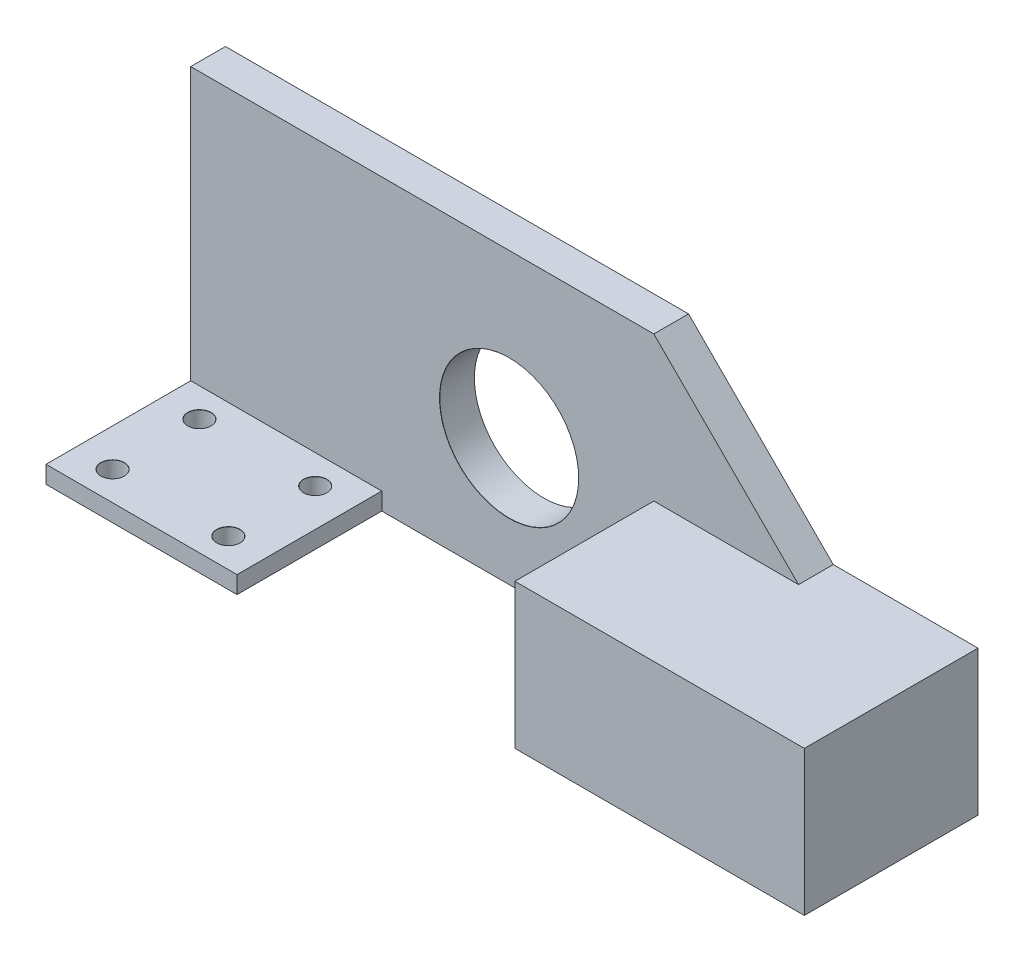
ISO-10303-21;
HEADER;
FILE_DESCRIPTION(('STEP AP214'),'2;1');
FILE_NAME('part.step','',(''),(''),'','','');
FILE_SCHEMA(('AUTOMOTIVE_DESIGN { 1 0 10303 214 1 1 1 1 }'));
ENDSEC;
DATA;
#1=APPLICATION_CONTEXT('core data for automotive mechanical design processes');
#2=APPLICATION_PROTOCOL_DEFINITION('international standard','automotive_design',2000,#1);
#3=PRODUCT_CONTEXT('',#1,'mechanical');
#4=PRODUCT('Part','Part','',(#3));
#5=PRODUCT_RELATED_PRODUCT_CATEGORY('part','',(#4));
#6=PRODUCT_DEFINITION_FORMATION('','',#4);
#7=PRODUCT_DEFINITION_CONTEXT('part definition',#1,'design');
#8=PRODUCT_DEFINITION('design','',#6,#7);
#9=PRODUCT_DEFINITION_SHAPE('','',#8);
#10=(LENGTH_UNIT() NAMED_UNIT(*) SI_UNIT(.MILLI.,.METRE.));
#11=(NAMED_UNIT(*) PLANE_ANGLE_UNIT() SI_UNIT($,.RADIAN.));
#12=(NAMED_UNIT(*) SI_UNIT($,.STERADIAN.) SOLID_ANGLE_UNIT());
#13=UNCERTAINTY_MEASURE_WITH_UNIT(LENGTH_MEASURE(1.E-05),#10,'distance_accuracy_value','');
#14=(GEOMETRIC_REPRESENTATION_CONTEXT(3) GLOBAL_UNCERTAINTY_ASSIGNED_CONTEXT((#13)) GLOBAL_UNIT_ASSIGNED_CONTEXT((#10,
#11,#12)) REPRESENTATION_CONTEXT('',''));
#15=CARTESIAN_POINT('',(0.,0.,0.));
#16=DIRECTION('',(0.,0.,1.));
#17=DIRECTION('',(1.,0.,0.));
#18=AXIS2_PLACEMENT_3D('',#15,#16,#17);
#19=CARTESIAN_POINT('',(-40.,40.,3.));
#20=DIRECTION('',(1.,0.,0.));
#21=DIRECTION('',(0.,1.,0.));
#22=AXIS2_PLACEMENT_3D('',#19,#20,#21);
#23=PLANE('',#22);
#24=DIRECTION('',(0.,-1.,0.));
#25=VECTOR('',#24,1.);
#26=CARTESIAN_POINT('',(-40.,40.,3.));
#27=LINE('',#26,#25);
#28=CARTESIAN_POINT('',(-40.,10.,3.));
#29=VERTEX_POINT('',#28);
#30=CARTESIAN_POINT('',(-40.,-37.,3.));
#31=VERTEX_POINT('',#30);
#32=EDGE_CURVE('E268',#29,#31,#27,.T.);
#33=ORIENTED_EDGE('',*,*,#32,.F.);
#34=DIRECTION('',(0.,0.,1.));
#35=VECTOR('',#34,1.);
#36=CARTESIAN_POINT('',(-40.,10.,-12.));
#37=LINE('',#36,#35);
#38=CARTESIAN_POINT('',(-40.,10.,-3.));
#39=VERTEX_POINT('',#38);
#40=EDGE_CURVE('E179',#39,#29,#37,.T.);
#41=ORIENTED_EDGE('',*,*,#40,.F.);
#42=DIRECTION('',(0.,-1.,0.));
#43=VECTOR('',#42,1.);
#44=CARTESIAN_POINT('',(-40.,40.,-3.));
#45=LINE('',#44,#43);
#46=CARTESIAN_POINT('',(-40.,-40.,-3.));
#47=VERTEX_POINT('',#46);
#48=EDGE_CURVE('E264',#39,#47,#45,.T.);
#49=ORIENTED_EDGE('',*,*,#48,.T.);
#50=DIRECTION('',(0.,0.,-1.));
#51=VECTOR('',#50,1.);
#52=CARTESIAN_POINT('',(-40.,-40.,3.));
#53=LINE('',#52,#51);
#54=CARTESIAN_POINT('',(-40.,-40.,28.));
#55=VERTEX_POINT('',#54);
#56=EDGE_CURVE('E276',#55,#47,#53,.T.);
#57=ORIENTED_EDGE('',*,*,#56,.F.);
#58=DIRECTION('',(0.,-1.,0.));
#59=VECTOR('',#58,1.);
#60=CARTESIAN_POINT('',(-40.,-40.,28.));
#61=LINE('',#60,#59);
#62=CARTESIAN_POINT('',(-40.,-37.,28.));
#63=VERTEX_POINT('',#62);
#64=EDGE_CURVE('E231',#63,#55,#61,.T.);
#65=ORIENTED_EDGE('',*,*,#64,.F.);
#66=DIRECTION('',(0.,0.,-1.));
#67=VECTOR('',#66,1.);
#68=CARTESIAN_POINT('',(-40.,-37.,28.));
#69=LINE('',#68,#67);
#70=EDGE_CURVE('E245',#63,#31,#69,.T.);
#71=ORIENTED_EDGE('',*,*,#70,.T.);
#72=EDGE_LOOP('',(#33,#41,#49,#57,#65,#71));
#73=FACE_BOUND('',#72,.T.);
#74=ADVANCED_FACE('F45',(#73),#23,.F.);
#75=CARTESIAN_POINT('',(-40.,-40.,3.));
#76=DIRECTION('',(0.,1.,0.));
#77=DIRECTION('',(0.,0.,1.));
#78=AXIS2_PLACEMENT_3D('',#75,#76,#77);
#79=PLANE('',#78);
#80=CARTESIAN_POINT('',(-33.5,-40.,8.));
#81=DIRECTION('',(0.,1.,0.));
#82=DIRECTION('',(0.,0.,1.));
#83=AXIS2_PLACEMENT_3D('',#80,#81,#82);
#84=CIRCLE('',#83,2.);
#85=CARTESIAN_POINT('',(-33.5,-40.,10.));
#86=VERTEX_POINT('',#85);
#87=EDGE_CURVE('E203',#86,#86,#84,.T.);
#88=ORIENTED_EDGE('',*,*,#87,.T.);
#89=EDGE_LOOP('',(#88));
#90=FACE_BOUND('',#89,.T.);
#91=CARTESIAN_POINT('',(-13.5,-40.,8.));
#92=DIRECTION('',(0.,1.,0.));
#93=DIRECTION('',(0.,0.,1.));
#94=AXIS2_PLACEMENT_3D('',#91,#92,#93);
#95=CIRCLE('',#94,2.);
#96=CARTESIAN_POINT('',(-13.5,-40.,10.));
#97=VERTEX_POINT('',#96);
#98=EDGE_CURVE('E212',#97,#97,#95,.T.);
#99=ORIENTED_EDGE('',*,*,#98,.T.);
#100=EDGE_LOOP('',(#99));
#101=FACE_BOUND('',#100,.T.);
#102=CARTESIAN_POINT('',(-13.5,-40.,23.));
#103=DIRECTION('',(0.,1.,0.));
#104=DIRECTION('',(0.,0.,1.));
#105=AXIS2_PLACEMENT_3D('',#102,#103,#104);
#106=CIRCLE('',#105,2.);
#107=CARTESIAN_POINT('',(-13.5,-40.,25.));
#108=VERTEX_POINT('',#107);
#109=EDGE_CURVE('E221',#108,#108,#106,.T.);
#110=ORIENTED_EDGE('',*,*,#109,.T.);
#111=EDGE_LOOP('',(#110));
#112=FACE_BOUND('',#111,.T.);
#113=CARTESIAN_POINT('',(-33.5,-40.,23.));
#114=DIRECTION('',(0.,1.,0.));
#115=DIRECTION('',(0.,0.,1.));
#116=AXIS2_PLACEMENT_3D('',#113,#114,#115);
#117=CIRCLE('',#116,2.);
#118=CARTESIAN_POINT('',(-33.5,-40.,25.));
#119=VERTEX_POINT('',#118);
#120=EDGE_CURVE('E230',#119,#119,#117,.T.);
#121=ORIENTED_EDGE('',*,*,#120,.T.);
#122=EDGE_LOOP('',(#121));
#123=FACE_BOUND('',#122,.T.);
#124=DIRECTION('',(1.,0.,0.));
#125=VECTOR('',#124,1.);
#126=CARTESIAN_POINT('',(-40.,-40.,-3.));
#127=LINE('',#126,#125);
#128=CARTESIAN_POINT('',(90.,-40.,-3.));
#129=VERTEX_POINT('',#128);
#130=EDGE_CURVE('E269',#47,#129,#127,.T.);
#131=ORIENTED_EDGE('',*,*,#130,.T.);
#132=DIRECTION('',(0.,0.,-1.));
#133=VECTOR('',#132,1.);
#134=CARTESIAN_POINT('',(90.,-40.,27.));
#135=LINE('',#134,#133);
#136=CARTESIAN_POINT('',(90.,-40.,27.));
#137=VERTEX_POINT('',#136);
#138=EDGE_CURVE('E170',#137,#129,#135,.T.);
#139=ORIENTED_EDGE('',*,*,#138,.F.);
#140=DIRECTION('',(-1.,0.,0.));
#141=VECTOR('',#140,1.);
#142=CARTESIAN_POINT('',(40.,-40.,27.));
#143=LINE('',#142,#141);
#144=CARTESIAN_POINT('',(40.,-40.,27.));
#145=VERTEX_POINT('',#144);
#146=EDGE_CURVE('E137',#137,#145,#143,.T.);
#147=ORIENTED_EDGE('',*,*,#146,.T.);
#148=DIRECTION('',(0.,0.,-1.));
#149=VECTOR('',#148,1.);
#150=CARTESIAN_POINT('',(40.,-40.,27.));
#151=LINE('',#150,#149);
#152=CARTESIAN_POINT('',(40.,-40.,3.));
#153=VERTEX_POINT('',#152);
#154=EDGE_CURVE('E152',#145,#153,#151,.T.);
#155=ORIENTED_EDGE('',*,*,#154,.T.);
#156=DIRECTION('',(1.,0.,0.));
#157=VECTOR('',#156,1.);
#158=CARTESIAN_POINT('',(-40.,-40.,3.));
#159=LINE('',#158,#157);
#160=CARTESIAN_POINT('',(-7.00000000000001,-40.,3.));
#161=VERTEX_POINT('',#160);
#162=EDGE_CURVE('E272',#161,#153,#159,.T.);
#163=ORIENTED_EDGE('',*,*,#162,.F.);
#164=DIRECTION('',(0.,0.,-1.));
#165=VECTOR('',#164,1.);
#166=CARTESIAN_POINT('',(-7.00000000000001,-40.,28.));
#167=LINE('',#166,#165);
#168=CARTESIAN_POINT('',(-7.00000000000001,-40.,28.));
#169=VERTEX_POINT('',#168);
#170=EDGE_CURVE('E260',#169,#161,#167,.T.);
#171=ORIENTED_EDGE('',*,*,#170,.F.);
#172=DIRECTION('',(1.,0.,0.));
#173=VECTOR('',#172,1.);
#174=CARTESIAN_POINT('',(-40.,-40.,28.));
#175=LINE('',#174,#173);
#176=EDGE_CURVE('E235',#55,#169,#175,.T.);
#177=ORIENTED_EDGE('',*,*,#176,.F.);
#178=ORIENTED_EDGE('',*,*,#56,.T.);
#179=EDGE_LOOP('',(#131,#139,#147,#155,#163,#171,#177,#178));
#180=FACE_BOUND('',#179,.T.);
#181=ADVANCED_FACE('F324',(#90,#101,#112,#123,#180),#79,.F.);
#182=CARTESIAN_POINT('',(0.,0.,3.));
#183=DIRECTION('',(0.,0.,1.));
#184=DIRECTION('',(1.,0.,0.));
#185=AXIS2_PLACEMENT_3D('',#182,#183,#184);
#186=PLANE('',#185);
#187=DIRECTION('',(1.,0.,0.));
#188=VECTOR('',#187,1.);
#189=CARTESIAN_POINT('',(-40.,10.,3.));
#190=LINE('',#189,#188);
#191=CARTESIAN_POINT('',(40.,10.,3.));
#192=VERTEX_POINT('',#191);
#193=EDGE_CURVE('E169',#29,#192,#190,.T.);
#194=ORIENTED_EDGE('',*,*,#193,.F.);
#195=ORIENTED_EDGE('',*,*,#32,.T.);
#196=DIRECTION('',(-1.,0.,0.));
#197=VECTOR('',#196,1.);
#198=CARTESIAN_POINT('',(-40.,-37.,3.));
#199=LINE('',#198,#197);
#200=CARTESIAN_POINT('',(-7.00000000000001,-37.,3.));
#201=VERTEX_POINT('',#200);
#202=EDGE_CURVE('E236',#201,#31,#199,.T.);
#203=ORIENTED_EDGE('',*,*,#202,.F.);
#204=DIRECTION('',(0.,1.,0.));
#205=VECTOR('',#204,1.);
#206=CARTESIAN_POINT('',(-7.00000000000001,-40.,3.));
#207=LINE('',#206,#205);
#208=EDGE_CURVE('E246',#161,#201,#207,.T.);
#209=ORIENTED_EDGE('',*,*,#208,.F.);
#210=ORIENTED_EDGE('',*,*,#162,.T.);
#211=DIRECTION('',(0.,1.,0.));
#212=VECTOR('',#211,1.);
#213=CARTESIAN_POINT('',(40.,40.,3.));
#214=LINE('',#213,#212);
#215=CARTESIAN_POINT('',(40.,-15.,3.));
#216=VERTEX_POINT('',#215);
#217=EDGE_CURVE('E265',#153,#216,#214,.T.);
#218=ORIENTED_EDGE('',*,*,#217,.T.);
#219=DIRECTION('',(-1.,0.,0.));
#220=VECTOR('',#219,1.);
#221=CARTESIAN_POINT('',(0.,-15.,3.));
#222=LINE('',#221,#220);
#223=CARTESIAN_POINT('',(65.,-15.,3.));
#224=VERTEX_POINT('',#223);
#225=EDGE_CURVE('E61',#224,#216,#222,.T.);
#226=ORIENTED_EDGE('',*,*,#225,.F.);
#227=DIRECTION('',(-0.707106781186544,0.707106781186551,0.));
#228=VECTOR('',#227,1.);
#229=CARTESIAN_POINT('',(40.,10.0000000000002,3.));
#230=LINE('',#229,#228);
#231=EDGE_CURVE('E11',#224,#192,#230,.T.);
#232=ORIENTED_EDGE('',*,*,#231,.T.);
#233=EDGE_LOOP('',(#194,#195,#203,#209,#210,#218,#226,#232));
#234=FACE_BOUND('',#233,.T.);
#235=CARTESIAN_POINT('',(15.,-18.07,3.));
#236=DIRECTION('',(0.,0.,1.));
#237=DIRECTION('',(1.,0.,0.));
#238=AXIS2_PLACEMENT_3D('',#235,#236,#237);
#239=CIRCLE('',#238,12.025);
#240=CARTESIAN_POINT('',(27.025,-18.07,3.));
#241=VERTEX_POINT('',#240);
#242=EDGE_CURVE('E184',#241,#241,#239,.T.);
#243=ORIENTED_EDGE('',*,*,#242,.F.);
#244=EDGE_LOOP('',(#243));
#245=FACE_BOUND('',#244,.T.);
#246=ADVANCED_FACE('F312',(#234,#245),#186,.T.);
#247=CARTESIAN_POINT('',(0.,0.,-3.));
#248=DIRECTION('',(0.,0.,1.));
#249=DIRECTION('',(1.,0.,0.));
#250=AXIS2_PLACEMENT_3D('',#247,#248,#249);
#251=PLANE('',#250);
#252=CARTESIAN_POINT('',(15.,-18.07,-3.));
#253=DIRECTION('',(0.,0.,1.));
#254=DIRECTION('',(1.,0.,0.));
#255=AXIS2_PLACEMENT_3D('',#252,#253,#254);
#256=CIRCLE('',#255,12.);
#257=CARTESIAN_POINT('',(27.,-18.07,-3.));
#258=VERTEX_POINT('',#257);
#259=EDGE_CURVE('E194',#258,#258,#256,.T.);
#260=ORIENTED_EDGE('',*,*,#259,.T.);
#261=EDGE_LOOP('',(#260));
#262=FACE_BOUND('',#261,.T.);
#263=ORIENTED_EDGE('',*,*,#48,.F.);
#264=DIRECTION('',(1.,0.,0.));
#265=VECTOR('',#264,1.);
#266=CARTESIAN_POINT('',(0.,10.,-3.));
#267=LINE('',#266,#265);
#268=CARTESIAN_POINT('',(40.,10.,-3.));
#269=VERTEX_POINT('',#268);
#270=EDGE_CURVE('E284',#39,#269,#267,.T.);
#271=ORIENTED_EDGE('',*,*,#270,.T.);
#272=DIRECTION('',(0.707106781186544,-0.707106781186551,0.));
#273=VECTOR('',#272,1.);
#274=CARTESIAN_POINT('',(25.0000000000003,25.0000000000001,-3.));
#275=LINE('',#274,#273);
#276=CARTESIAN_POINT('',(65.,-15.,-3.));
#277=VERTEX_POINT('',#276);
#278=EDGE_CURVE('E55',#269,#277,#275,.T.);
#279=ORIENTED_EDGE('',*,*,#278,.T.);
#280=DIRECTION('',(1.,0.,0.));
#281=VECTOR('',#280,1.);
#282=CARTESIAN_POINT('',(40.,-15.,-3.));
#283=LINE('',#282,#281);
#284=CARTESIAN_POINT('',(90.,-15.,-3.));
#285=VERTEX_POINT('',#284);
#286=EDGE_CURVE('E158',#277,#285,#283,.T.);
#287=ORIENTED_EDGE('',*,*,#286,.T.);
#288=DIRECTION('',(0.,-1.,0.));
#289=VECTOR('',#288,1.);
#290=CARTESIAN_POINT('',(90.,-15.,-3.));
#291=LINE('',#290,#289);
#292=EDGE_CURVE('E154',#285,#129,#291,.T.);
#293=ORIENTED_EDGE('',*,*,#292,.T.);
#294=ORIENTED_EDGE('',*,*,#130,.F.);
#295=EDGE_LOOP('',(#263,#271,#279,#287,#293,#294));
#296=FACE_BOUND('',#295,.T.);
#297=ADVANCED_FACE('F321',(#262,#296),#251,.F.);
#298=CARTESIAN_POINT('',(-7.00000000000001,-40.,28.));
#299=DIRECTION('',(-1.,0.,0.));
#300=DIRECTION('',(0.,0.,1.));
#301=AXIS2_PLACEMENT_3D('',#298,#299,#300);
#302=PLANE('',#301);
#303=ORIENTED_EDGE('',*,*,#208,.T.);
#304=DIRECTION('',(0.,0.,-1.));
#305=VECTOR('',#304,1.);
#306=CARTESIAN_POINT('',(-7.00000000000001,-37.,28.));
#307=LINE('',#306,#305);
#308=CARTESIAN_POINT('',(-7.00000000000001,-37.,28.));
#309=VERTEX_POINT('',#308);
#310=EDGE_CURVE('E256',#309,#201,#307,.T.);
#311=ORIENTED_EDGE('',*,*,#310,.F.);
#312=DIRECTION('',(0.,1.,0.));
#313=VECTOR('',#312,1.);
#314=CARTESIAN_POINT('',(-7.00000000000001,-40.,28.));
#315=LINE('',#314,#313);
#316=EDGE_CURVE('E239',#169,#309,#315,.T.);
#317=ORIENTED_EDGE('',*,*,#316,.F.);
#318=ORIENTED_EDGE('',*,*,#170,.T.);
#319=EDGE_LOOP('',(#303,#311,#317,#318));
#320=FACE_BOUND('',#319,.T.);
#321=ADVANCED_FACE('F332',(#320),#302,.F.);
#322=CARTESIAN_POINT('',(-40.,-37.,28.));
#323=DIRECTION('',(0.,-1.,0.));
#324=DIRECTION('',(0.,0.,-1.));
#325=AXIS2_PLACEMENT_3D('',#322,#323,#324);
#326=PLANE('',#325);
#327=CARTESIAN_POINT('',(-33.5,-37.,8.));
#328=DIRECTION('',(0.,1.,0.));
#329=DIRECTION('',(0.,0.,1.));
#330=AXIS2_PLACEMENT_3D('',#327,#328,#329);
#331=CIRCLE('',#330,2.025);
#332=CARTESIAN_POINT('',(-33.5,-37.,10.025));
#333=VERTEX_POINT('',#332);
#334=EDGE_CURVE('E195',#333,#333,#331,.T.);
#335=ORIENTED_EDGE('',*,*,#334,.F.);
#336=EDGE_LOOP('',(#335));
#337=FACE_BOUND('',#336,.T.);
#338=CARTESIAN_POINT('',(-13.5,-37.,8.));
#339=DIRECTION('',(0.,1.,0.));
#340=DIRECTION('',(0.,0.,1.));
#341=AXIS2_PLACEMENT_3D('',#338,#339,#340);
#342=CIRCLE('',#341,2.025);
#343=CARTESIAN_POINT('',(-13.5,-37.,10.025));
#344=VERTEX_POINT('',#343);
#345=EDGE_CURVE('E204',#344,#344,#342,.T.);
#346=ORIENTED_EDGE('',*,*,#345,.F.);
#347=EDGE_LOOP('',(#346));
#348=FACE_BOUND('',#347,.T.);
#349=CARTESIAN_POINT('',(-13.5,-37.,23.));
#350=DIRECTION('',(0.,1.,0.));
#351=DIRECTION('',(0.,0.,1.));
#352=AXIS2_PLACEMENT_3D('',#349,#350,#351);
#353=CIRCLE('',#352,2.025);
#354=CARTESIAN_POINT('',(-13.5,-37.,25.025));
#355=VERTEX_POINT('',#354);
#356=EDGE_CURVE('E213',#355,#355,#353,.T.);
#357=ORIENTED_EDGE('',*,*,#356,.F.);
#358=EDGE_LOOP('',(#357));
#359=FACE_BOUND('',#358,.T.);
#360=CARTESIAN_POINT('',(-33.5,-37.,23.));
#361=DIRECTION('',(0.,1.,0.));
#362=DIRECTION('',(0.,0.,1.));
#363=AXIS2_PLACEMENT_3D('',#360,#361,#362);
#364=CIRCLE('',#363,2.025);
#365=CARTESIAN_POINT('',(-33.5,-37.,25.025));
#366=VERTEX_POINT('',#365);
#367=EDGE_CURVE('E222',#366,#366,#364,.T.);
#368=ORIENTED_EDGE('',*,*,#367,.F.);
#369=EDGE_LOOP('',(#368));
#370=FACE_BOUND('',#369,.T.);
#371=ORIENTED_EDGE('',*,*,#202,.T.);
#372=ORIENTED_EDGE('',*,*,#70,.F.);
#373=DIRECTION('',(-1.,0.,0.));
#374=VECTOR('',#373,1.);
#375=CARTESIAN_POINT('',(-40.,-37.,28.));
#376=LINE('',#375,#374);
#377=EDGE_CURVE('E242',#309,#63,#376,.T.);
#378=ORIENTED_EDGE('',*,*,#377,.F.);
#379=ORIENTED_EDGE('',*,*,#310,.T.);
#380=EDGE_LOOP('',(#371,#372,#378,#379));
#381=FACE_BOUND('',#380,.T.);
#382=ADVANCED_FACE('F336',(#337,#348,#359,#370,#381),#326,.F.);
#383=CARTESIAN_POINT('',(0.,0.,28.));
#384=DIRECTION('',(0.,0.,-1.));
#385=DIRECTION('',(-1.,0.,0.));
#386=AXIS2_PLACEMENT_3D('',#383,#384,#385);
#387=PLANE('',#386);
#388=ORIENTED_EDGE('',*,*,#64,.T.);
#389=ORIENTED_EDGE('',*,*,#176,.T.);
#390=ORIENTED_EDGE('',*,*,#316,.T.);
#391=ORIENTED_EDGE('',*,*,#377,.T.);
#392=EDGE_LOOP('',(#388,#389,#390,#391));
#393=FACE_BOUND('',#392,.T.);
#394=ADVANCED_FACE('F340',(#393),#387,.F.);
#395=CARTESIAN_POINT('',(-33.5,-37.,23.));
#396=DIRECTION('',(0.,1.,0.));
#397=DIRECTION('',(0.,0.,1.));
#398=AXIS2_PLACEMENT_3D('',#395,#396,#397);
#399=CYLINDRICAL_SURFACE('',#398,2.);
#400=CARTESIAN_POINT('',(-33.5,-37.025,23.));
#401=DIRECTION('',(0.,1.,0.));
#402=DIRECTION('',(0.,0.,1.));
#403=AXIS2_PLACEMENT_3D('',#400,#401,#402);
#404=CIRCLE('',#403,2.);
#405=CARTESIAN_POINT('',(-33.5,-37.025,25.));
#406=VERTEX_POINT('',#405);
#407=EDGE_CURVE('E226',#406,#406,#404,.T.);
#408=ORIENTED_EDGE('',*,*,#407,.T.);
#409=EDGE_LOOP('',(#408));
#410=FACE_BOUND('',#409,.T.);
#411=ORIENTED_EDGE('',*,*,#120,.F.);
#412=EDGE_LOOP('',(#411));
#413=FACE_BOUND('',#412,.T.);
#414=ADVANCED_FACE('F342',(#410,#413),#399,.F.);
#415=CARTESIAN_POINT('',(-33.5,-37.,23.));
#416=DIRECTION('',(0.,1.,0.));
#417=DIRECTION('',(0.,0.,1.));
#418=AXIS2_PLACEMENT_3D('',#415,#416,#417);
#419=CONICAL_SURFACE('',#418,2.025,0.785398163397448);
#420=ORIENTED_EDGE('',*,*,#407,.F.);
#421=EDGE_LOOP('',(#420));
#422=FACE_BOUND('',#421,.T.);
#423=ORIENTED_EDGE('',*,*,#367,.T.);
#424=EDGE_LOOP('',(#423));
#425=FACE_BOUND('',#424,.T.);
#426=ADVANCED_FACE('F348',(#422,#425),#419,.F.);
#427=CARTESIAN_POINT('',(-13.5,-37.,23.));
#428=DIRECTION('',(0.,1.,0.));
#429=DIRECTION('',(0.,0.,1.));
#430=AXIS2_PLACEMENT_3D('',#427,#428,#429);
#431=CYLINDRICAL_SURFACE('',#430,2.);
#432=CARTESIAN_POINT('',(-13.5,-37.025,23.));
#433=DIRECTION('',(0.,1.,0.));
#434=DIRECTION('',(0.,0.,1.));
#435=AXIS2_PLACEMENT_3D('',#432,#433,#434);
#436=CIRCLE('',#435,2.);
#437=CARTESIAN_POINT('',(-13.5,-37.025,25.));
#438=VERTEX_POINT('',#437);
#439=EDGE_CURVE('E217',#438,#438,#436,.T.);
#440=ORIENTED_EDGE('',*,*,#439,.T.);
#441=EDGE_LOOP('',(#440));
#442=FACE_BOUND('',#441,.T.);
#443=ORIENTED_EDGE('',*,*,#109,.F.);
#444=EDGE_LOOP('',(#443));
#445=FACE_BOUND('',#444,.T.);
#446=ADVANCED_FACE('F393',(#442,#445),#431,.F.);
#447=CARTESIAN_POINT('',(-13.5,-37.,23.));
#448=DIRECTION('',(0.,1.,0.));
#449=DIRECTION('',(0.,0.,1.));
#450=AXIS2_PLACEMENT_3D('',#447,#448,#449);
#451=CONICAL_SURFACE('',#450,2.025,0.785398163397518);
#452=ORIENTED_EDGE('',*,*,#439,.F.);
#453=EDGE_LOOP('',(#452));
#454=FACE_BOUND('',#453,.T.);
#455=ORIENTED_EDGE('',*,*,#356,.T.);
#456=EDGE_LOOP('',(#455));
#457=FACE_BOUND('',#456,.T.);
#458=ADVANCED_FACE('F404',(#454,#457),#451,.F.);
#459=CARTESIAN_POINT('',(-13.5,-37.,8.));
#460=DIRECTION('',(0.,1.,0.));
#461=DIRECTION('',(0.,0.,1.));
#462=AXIS2_PLACEMENT_3D('',#459,#460,#461);
#463=CYLINDRICAL_SURFACE('',#462,2.);
#464=CARTESIAN_POINT('',(-13.5,-37.025,8.));
#465=DIRECTION('',(0.,1.,0.));
#466=DIRECTION('',(0.,0.,1.));
#467=AXIS2_PLACEMENT_3D('',#464,#465,#466);
#468=CIRCLE('',#467,2.);
#469=CARTESIAN_POINT('',(-13.5,-37.025,10.));
#470=VERTEX_POINT('',#469);
#471=EDGE_CURVE('E208',#470,#470,#468,.T.);
#472=ORIENTED_EDGE('',*,*,#471,.T.);
#473=EDGE_LOOP('',(#472));
#474=FACE_BOUND('',#473,.T.);
#475=ORIENTED_EDGE('',*,*,#98,.F.);
#476=EDGE_LOOP('',(#475));
#477=FACE_BOUND('',#476,.T.);
#478=ADVANCED_FACE('F415',(#474,#477),#463,.F.);
#479=CARTESIAN_POINT('',(-13.5,-37.,8.));
#480=DIRECTION('',(0.,1.,0.));
#481=DIRECTION('',(0.,0.,1.));
#482=AXIS2_PLACEMENT_3D('',#479,#480,#481);
#483=CONICAL_SURFACE('',#482,2.025,0.785398163397518);
#484=ORIENTED_EDGE('',*,*,#471,.F.);
#485=EDGE_LOOP('',(#484));
#486=FACE_BOUND('',#485,.T.);
#487=ORIENTED_EDGE('',*,*,#345,.T.);
#488=EDGE_LOOP('',(#487));
#489=FACE_BOUND('',#488,.T.);
#490=ADVANCED_FACE('F426',(#486,#489),#483,.F.);
#491=CARTESIAN_POINT('',(-33.5,-37.,8.));
#492=DIRECTION('',(0.,1.,0.));
#493=DIRECTION('',(0.,0.,1.));
#494=AXIS2_PLACEMENT_3D('',#491,#492,#493);
#495=CYLINDRICAL_SURFACE('',#494,2.);
#496=CARTESIAN_POINT('',(-33.5,-37.025,8.));
#497=DIRECTION('',(0.,1.,0.));
#498=DIRECTION('',(0.,0.,1.));
#499=AXIS2_PLACEMENT_3D('',#496,#497,#498);
#500=CIRCLE('',#499,2.);
#501=CARTESIAN_POINT('',(-33.5,-37.025,10.));
#502=VERTEX_POINT('',#501);
#503=EDGE_CURVE('E199',#502,#502,#500,.T.);
#504=ORIENTED_EDGE('',*,*,#503,.T.);
#505=EDGE_LOOP('',(#504));
#506=FACE_BOUND('',#505,.T.);
#507=ORIENTED_EDGE('',*,*,#87,.F.);
#508=EDGE_LOOP('',(#507));
#509=FACE_BOUND('',#508,.T.);
#510=ADVANCED_FACE('F437',(#506,#509),#495,.F.);
#511=CARTESIAN_POINT('',(-33.5,-37.,8.));
#512=DIRECTION('',(0.,1.,0.));
#513=DIRECTION('',(0.,0.,1.));
#514=AXIS2_PLACEMENT_3D('',#511,#512,#513);
#515=CONICAL_SURFACE('',#514,2.025,0.785398163397448);
#516=ORIENTED_EDGE('',*,*,#503,.F.);
#517=EDGE_LOOP('',(#516));
#518=FACE_BOUND('',#517,.T.);
#519=ORIENTED_EDGE('',*,*,#334,.T.);
#520=EDGE_LOOP('',(#519));
#521=FACE_BOUND('',#520,.T.);
#522=ADVANCED_FACE('F448',(#518,#521),#515,.F.);
#523=CARTESIAN_POINT('',(15.,-18.07,3.));
#524=DIRECTION('',(0.,0.,1.));
#525=DIRECTION('',(1.,0.,0.));
#526=AXIS2_PLACEMENT_3D('',#523,#524,#525);
#527=CYLINDRICAL_SURFACE('',#526,12.);
#528=CARTESIAN_POINT('',(15.,-18.07,2.975));
#529=DIRECTION('',(0.,0.,1.));
#530=DIRECTION('',(1.,0.,0.));
#531=AXIS2_PLACEMENT_3D('',#528,#529,#530);
#532=CIRCLE('',#531,12.);
#533=CARTESIAN_POINT('',(27.,-18.07,2.975));
#534=VERTEX_POINT('',#533);
#535=EDGE_CURVE('E190',#534,#534,#532,.T.);
#536=ORIENTED_EDGE('',*,*,#535,.T.);
#537=EDGE_LOOP('',(#536));
#538=FACE_BOUND('',#537,.T.);
#539=ORIENTED_EDGE('',*,*,#259,.F.);
#540=EDGE_LOOP('',(#539));
#541=FACE_BOUND('',#540,.T.);
#542=ADVANCED_FACE('F459',(#538,#541),#527,.F.);
#543=CARTESIAN_POINT('',(15.,-18.07,3.));
#544=DIRECTION('',(0.,0.,1.));
#545=DIRECTION('',(1.,0.,0.));
#546=AXIS2_PLACEMENT_3D('',#543,#544,#545);
#547=CONICAL_SURFACE('',#546,12.025,0.785398163397431);
#548=ORIENTED_EDGE('',*,*,#535,.F.);
#549=EDGE_LOOP('',(#548));
#550=FACE_BOUND('',#549,.T.);
#551=ORIENTED_EDGE('',*,*,#242,.T.);
#552=EDGE_LOOP('',(#551));
#553=FACE_BOUND('',#552,.T.);
#554=ADVANCED_FACE('F470',(#550,#553),#547,.F.);
#555=CARTESIAN_POINT('',(-40.,10.,-12.));
#556=DIRECTION('',(0.,-1.,0.));
#557=DIRECTION('',(0.,0.,-1.));
#558=AXIS2_PLACEMENT_3D('',#555,#556,#557);
#559=PLANE('',#558);
#560=ORIENTED_EDGE('',*,*,#40,.T.);
#561=ORIENTED_EDGE('',*,*,#193,.T.);
#562=DIRECTION('',(0.,0.,1.));
#563=VECTOR('',#562,1.);
#564=CARTESIAN_POINT('',(40.,10.,-12.));
#565=LINE('',#564,#563);
#566=EDGE_CURVE('E180',#269,#192,#565,.T.);
#567=ORIENTED_EDGE('',*,*,#566,.F.);
#568=ORIENTED_EDGE('',*,*,#270,.F.);
#569=EDGE_LOOP('',(#560,#561,#567,#568));
#570=FACE_BOUND('',#569,.T.);
#571=ADVANCED_FACE('F316',(#570),#559,.F.);
#572=CARTESIAN_POINT('',(40.,-15.,27.));
#573=DIRECTION('',(-1.,0.,0.));
#574=DIRECTION('',(0.,0.,1.));
#575=AXIS2_PLACEMENT_3D('',#572,#573,#574);
#576=PLANE('',#575);
#577=ORIENTED_EDGE('',*,*,#217,.F.);
#578=ORIENTED_EDGE('',*,*,#154,.F.);
#579=DIRECTION('',(0.,1.,0.));
#580=VECTOR('',#579,1.);
#581=CARTESIAN_POINT('',(40.,-15.,27.));
#582=LINE('',#581,#580);
#583=CARTESIAN_POINT('',(40.,-15.,27.));
#584=VERTEX_POINT('',#583);
#585=EDGE_CURVE('E144',#145,#584,#582,.T.);
#586=ORIENTED_EDGE('',*,*,#585,.T.);
#587=DIRECTION('',(0.,0.,-1.));
#588=VECTOR('',#587,1.);
#589=CARTESIAN_POINT('',(40.,-15.,27.));
#590=LINE('',#589,#588);
#591=EDGE_CURVE('E128',#584,#216,#590,.T.);
#592=ORIENTED_EDGE('',*,*,#591,.T.);
#593=EDGE_LOOP('',(#577,#578,#586,#592));
#594=FACE_BOUND('',#593,.T.);
#595=ADVANCED_FACE('F150',(#594),#576,.T.);
#596=CARTESIAN_POINT('',(90.,-15.,27.));
#597=DIRECTION('',(1.,0.,0.));
#598=DIRECTION('',(0.,0.,-1.));
#599=AXIS2_PLACEMENT_3D('',#596,#597,#598);
#600=PLANE('',#599);
#601=ORIENTED_EDGE('',*,*,#292,.F.);
#602=DIRECTION('',(0.,0.,-1.));
#603=VECTOR('',#602,1.);
#604=CARTESIAN_POINT('',(90.,-15.,27.));
#605=LINE('',#604,#603);
#606=CARTESIAN_POINT('',(90.,-15.,27.));
#607=VERTEX_POINT('',#606);
#608=EDGE_CURVE('E136',#607,#285,#605,.T.);
#609=ORIENTED_EDGE('',*,*,#608,.F.);
#610=DIRECTION('',(0.,-1.,0.));
#611=VECTOR('',#610,1.);
#612=CARTESIAN_POINT('',(90.,-15.,27.));
#613=LINE('',#612,#611);
#614=EDGE_CURVE('E147',#607,#137,#613,.T.);
#615=ORIENTED_EDGE('',*,*,#614,.T.);
#616=ORIENTED_EDGE('',*,*,#138,.T.);
#617=EDGE_LOOP('',(#601,#609,#615,#616));
#618=FACE_BOUND('',#617,.T.);
#619=ADVANCED_FACE('F327',(#618),#600,.T.);
#620=CARTESIAN_POINT('',(40.,-15.,27.));
#621=DIRECTION('',(0.,1.,0.));
#622=DIRECTION('',(-1.,0.,0.));
#623=AXIS2_PLACEMENT_3D('',#620,#621,#622);
#624=PLANE('',#623);
#625=ORIENTED_EDGE('',*,*,#286,.F.);
#626=DIRECTION('',(0.,0.,1.));
#627=VECTOR('',#626,1.);
#628=CARTESIAN_POINT('',(65.,-15.,27.));
#629=LINE('',#628,#627);
#630=EDGE_CURVE('E304',#277,#224,#629,.T.);
#631=ORIENTED_EDGE('',*,*,#630,.T.);
#632=ORIENTED_EDGE('',*,*,#225,.T.);
#633=ORIENTED_EDGE('',*,*,#591,.F.);
#634=DIRECTION('',(1.,0.,0.));
#635=VECTOR('',#634,1.);
#636=CARTESIAN_POINT('',(40.,-15.,27.));
#637=LINE('',#636,#635);
#638=EDGE_CURVE('E132',#584,#607,#637,.T.);
#639=ORIENTED_EDGE('',*,*,#638,.T.);
#640=ORIENTED_EDGE('',*,*,#608,.T.);
#641=EDGE_LOOP('',(#625,#631,#632,#633,#639,#640));
#642=FACE_BOUND('',#641,.T.);
#643=ADVANCED_FACE('F130',(#642),#624,.T.);
#644=CARTESIAN_POINT('',(0.,0.,27.));
#645=DIRECTION('',(0.,0.,1.));
#646=DIRECTION('',(1.,0.,0.));
#647=AXIS2_PLACEMENT_3D('',#644,#645,#646);
#648=PLANE('',#647);
#649=ORIENTED_EDGE('',*,*,#585,.F.);
#650=ORIENTED_EDGE('',*,*,#146,.F.);
#651=ORIENTED_EDGE('',*,*,#614,.F.);
#652=ORIENTED_EDGE('',*,*,#638,.F.);
#653=EDGE_LOOP('',(#649,#650,#651,#652));
#654=FACE_BOUND('',#653,.T.);
#655=ADVANCED_FACE('F142',(#654),#648,.T.);
#656=CARTESIAN_POINT('',(40.,10.0000000000002,3.));
#657=DIRECTION('',(-0.707106781186551,-0.707106781186544,0.));
#658=DIRECTION('',(0.,0.,-1.));
#659=AXIS2_PLACEMENT_3D('',#656,#657,#658);
#660=PLANE('',#659);
#661=ORIENTED_EDGE('',*,*,#231,.F.);
#662=ORIENTED_EDGE('',*,*,#630,.F.);
#663=ORIENTED_EDGE('',*,*,#278,.F.);
#664=ORIENTED_EDGE('',*,*,#566,.T.);
#665=EDGE_LOOP('',(#661,#662,#663,#664));
#666=FACE_BOUND('',#665,.T.);
#667=ADVANCED_FACE('F48',(#666),#660,.F.);
#668=CLOSED_SHELL('',(#74,#181,#246,#297,#321,#382,#394,#414,#426,#446,#458,#478,#490,#510,#522,
#542,#554,#571,#595,#619,#643,#655,#667));
#669=MANIFOLD_SOLID_BREP('B2',#668);
#670=ADVANCED_BREP_SHAPE_REPRESENTATION('',(#18,#669),#14);
#671=SHAPE_DEFINITION_REPRESENTATION(#9,#670);
ENDSEC;
END-ISO-10303-21;
